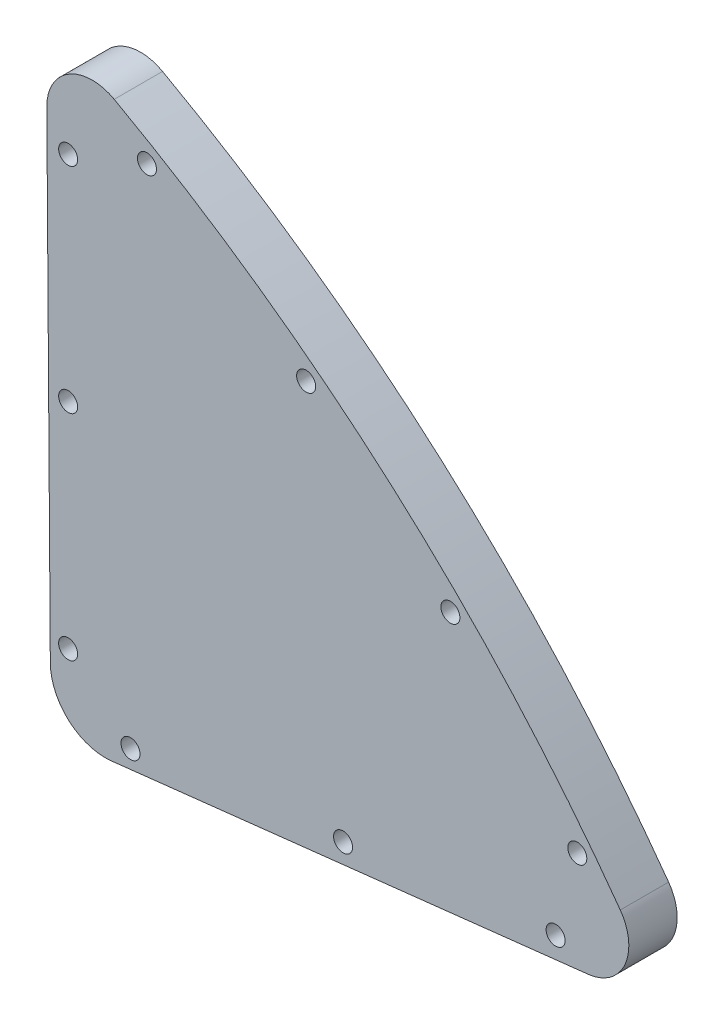
ISO-10303-21;
HEADER;
FILE_DESCRIPTION(('STEP AP214'),'2;1');
FILE_NAME('part.step','',(''),(''),'','','');
FILE_SCHEMA(('AUTOMOTIVE_DESIGN { 1 0 10303 214 1 1 1 1 }'));
ENDSEC;
DATA;
#1=APPLICATION_CONTEXT('core data for automotive mechanical design processes');
#2=APPLICATION_PROTOCOL_DEFINITION('international standard','automotive_design',2000,#1);
#3=PRODUCT_CONTEXT('',#1,'mechanical');
#4=PRODUCT('Part','Part','',(#3));
#5=PRODUCT_RELATED_PRODUCT_CATEGORY('part','',(#4));
#6=PRODUCT_DEFINITION_FORMATION('','',#4);
#7=PRODUCT_DEFINITION_CONTEXT('part definition',#1,'design');
#8=PRODUCT_DEFINITION('design','',#6,#7);
#9=PRODUCT_DEFINITION_SHAPE('','',#8);
#10=(LENGTH_UNIT() NAMED_UNIT(*) SI_UNIT(.MILLI.,.METRE.));
#11=(NAMED_UNIT(*) PLANE_ANGLE_UNIT() SI_UNIT($,.RADIAN.));
#12=(NAMED_UNIT(*) SI_UNIT($,.STERADIAN.) SOLID_ANGLE_UNIT());
#13=UNCERTAINTY_MEASURE_WITH_UNIT(LENGTH_MEASURE(1.E-05),#10,'distance_accuracy_value','');
#14=(GEOMETRIC_REPRESENTATION_CONTEXT(3) GLOBAL_UNCERTAINTY_ASSIGNED_CONTEXT((#13)) GLOBAL_UNIT_ASSIGNED_CONTEXT((#10,
#11,#12)) REPRESENTATION_CONTEXT('',''));
#15=CARTESIAN_POINT('',(0.,0.,0.));
#16=DIRECTION('',(0.,0.,1.));
#17=DIRECTION('',(1.,0.,0.));
#18=AXIS2_PLACEMENT_3D('',#15,#16,#17);
#19=CARTESIAN_POINT('',(-0.689341412487082,-11.2162631841353,12.7));
#20=DIRECTION('',(0.,0.,-1.));
#21=DIRECTION('',(-1.,0.,0.));
#22=AXIS2_PLACEMENT_3D('',#19,#20,#21);
#23=CYLINDRICAL_SURFACE('',#22,14.478);
#24=CARTESIAN_POINT('',(-0.689341412487082,-11.2162631841353,0.));
#25=DIRECTION('',(0.,0.,1.));
#26=DIRECTION('',(1.,0.,0.));
#27=AXIS2_PLACEMENT_3D('',#24,#25,#26);
#28=CIRCLE('',#27,14.478);
#29=CARTESIAN_POINT('',(-15.1669572143181,-11.3217368518089,0.));
#30=VERTEX_POINT('',#29);
#31=CARTESIAN_POINT('',(0.928877390943903,-25.6035440913888,0.));
#32=VERTEX_POINT('',#31);
#33=EDGE_CURVE('E123',#30,#32,#28,.T.);
#34=ORIENTED_EDGE('',*,*,#33,.T.);
#35=DIRECTION('',(0.,0.,-1.));
#36=VECTOR('',#35,1.);
#37=CARTESIAN_POINT('',(0.928877390943903,-25.6035440913888,12.7));
#38=LINE('',#37,#36);
#39=CARTESIAN_POINT('',(0.928877390943903,-25.6035440913888,12.7));
#40=VERTEX_POINT('',#39);
#41=EDGE_CURVE('E11',#40,#32,#38,.T.);
#42=ORIENTED_EDGE('',*,*,#41,.F.);
#43=CARTESIAN_POINT('',(-0.689341412487082,-11.2162631841353,12.7));
#44=DIRECTION('',(0.,0.,1.));
#45=DIRECTION('',(1.,0.,0.));
#46=AXIS2_PLACEMENT_3D('',#43,#44,#45);
#47=CIRCLE('',#46,14.478);
#48=CARTESIAN_POINT('',(-15.1669572143181,-11.3217368518089,12.7));
#49=VERTEX_POINT('',#48);
#50=EDGE_CURVE('E134',#49,#40,#47,.T.);
#51=ORIENTED_EDGE('',*,*,#50,.F.);
#52=DIRECTION('',(0.,0.,-1.));
#53=VECTOR('',#52,1.);
#54=CARTESIAN_POINT('',(-15.1669572143181,-11.3217368518089,12.7));
#55=LINE('',#54,#53);
#56=EDGE_CURVE('E119',#49,#30,#55,.T.);
#57=ORIENTED_EDGE('',*,*,#56,.T.);
#58=EDGE_LOOP('',(#34,#42,#51,#57));
#59=FACE_BOUND('',#58,.T.);
#60=ADVANCED_FACE('F39',(#59),#23,.T.);
#61=CARTESIAN_POINT('',(0.928877390943903,-25.6035440913888,12.7));
#62=DIRECTION('',(-0.111770880192778,0.993734003816379,0.));
#63=DIRECTION('',(-0.993734003816379,-0.111770880192778,0.));
#64=AXIS2_PLACEMENT_3D('',#61,#62,#63);
#65=PLANE('',#64);
#66=DIRECTION('',(0.993734003816379,0.111770880192778,0.));
#67=VECTOR('',#66,1.);
#68=CARTESIAN_POINT('',(0.928877390943903,-25.6035440913888,0.));
#69=LINE('',#68,#67);
#70=CARTESIAN_POINT('',(126.263071951833,-11.5064988151641,0.));
#71=VERTEX_POINT('',#70);
#72=EDGE_CURVE('E126',#32,#71,#69,.T.);
#73=ORIENTED_EDGE('',*,*,#72,.T.);
#74=DIRECTION('',(0.,0.,-1.));
#75=VECTOR('',#74,1.);
#76=CARTESIAN_POINT('',(126.263071951833,-11.5064988151641,12.7));
#77=LINE('',#76,#75);
#78=CARTESIAN_POINT('',(126.263071951833,-11.5064988151641,12.7));
#79=VERTEX_POINT('',#78);
#80=EDGE_CURVE('E47',#79,#71,#77,.T.);
#81=ORIENTED_EDGE('',*,*,#80,.F.);
#82=DIRECTION('',(0.993734003816379,0.111770880192778,0.));
#83=VECTOR('',#82,1.);
#84=CARTESIAN_POINT('',(0.928877390943903,-25.6035440913888,12.7));
#85=LINE('',#84,#83);
#86=EDGE_CURVE('E92',#40,#79,#85,.T.);
#87=ORIENTED_EDGE('',*,*,#86,.F.);
#88=ORIENTED_EDGE('',*,*,#41,.T.);
#89=EDGE_LOOP('',(#73,#81,#87,#88));
#90=FACE_BOUND('',#89,.T.);
#91=ADVANCED_FACE('F159',(#90),#65,.F.);
#92=CARTESIAN_POINT('',(124.928751184092,0.356697722395855,12.7));
#93=DIRECTION('',(0.,0.,-1.));
#94=DIRECTION('',(-1.,0.,0.));
#95=AXIS2_PLACEMENT_3D('',#92,#93,#94);
#96=CYLINDRICAL_SURFACE('',#95,11.938);
#97=CARTESIAN_POINT('',(124.928751184092,0.356697722395855,0.));
#98=DIRECTION('',(0.,0.,1.));
#99=DIRECTION('',(1.,0.,0.));
#100=AXIS2_PLACEMENT_3D('',#97,#98,#99);
#101=CIRCLE('',#100,11.938);
#102=CARTESIAN_POINT('',(134.616347536717,7.33282278639824,0.));
#103=VERTEX_POINT('',#102);
#104=EDGE_CURVE('E129',#71,#103,#101,.T.);
#105=ORIENTED_EDGE('',*,*,#104,.T.);
#106=DIRECTION('',(0.,0.,-1.));
#107=VECTOR('',#106,1.);
#108=CARTESIAN_POINT('',(134.616347536717,7.33282278639824,12.7));
#109=LINE('',#108,#107);
#110=CARTESIAN_POINT('',(134.616347536717,7.33282278639824,12.7));
#111=VERTEX_POINT('',#110);
#112=EDGE_CURVE('E114',#111,#103,#109,.T.);
#113=ORIENTED_EDGE('',*,*,#112,.F.);
#114=CARTESIAN_POINT('',(124.928751184092,0.356697722395855,12.7));
#115=DIRECTION('',(0.,0.,1.));
#116=DIRECTION('',(1.,0.,0.));
#117=AXIS2_PLACEMENT_3D('',#114,#115,#116);
#118=CIRCLE('',#117,11.938);
#119=EDGE_CURVE('E105',#79,#111,#118,.T.);
#120=ORIENTED_EDGE('',*,*,#119,.F.);
#121=ORIENTED_EDGE('',*,*,#80,.T.);
#122=EDGE_LOOP('',(#105,#113,#120,#121));
#123=FACE_BOUND('',#122,.T.);
#124=ADVANCED_FACE('F140',(#123),#96,.T.);
#125=CARTESIAN_POINT('',(-194.555809381209,-229.707001196831,12.7));
#126=DIRECTION('',(0.,0.,-1.));
#127=DIRECTION('',(-1.,0.,0.));
#128=AXIS2_PLACEMENT_3D('',#125,#126,#127);
#129=CYLINDRICAL_SURFACE('',#128,405.638);
#130=CARTESIAN_POINT('',(-194.555809381209,-229.707001196831,0.));
#131=DIRECTION('',(0.,0.,1.));
#132=DIRECTION('',(1.,0.,0.));
#133=AXIS2_PLACEMENT_3D('',#130,#131,#132);
#134=CIRCLE('',#133,405.638);
#135=CARTESIAN_POINT('',(1.62554957457208,125.335336338093,0.));
#136=VERTEX_POINT('',#135);
#137=EDGE_CURVE('E113',#103,#136,#134,.T.);
#138=ORIENTED_EDGE('',*,*,#137,.T.);
#139=DIRECTION('',(0.,0.,-1.));
#140=VECTOR('',#139,1.);
#141=CARTESIAN_POINT('',(1.62554957457208,125.335336338093,12.7));
#142=LINE('',#141,#140);
#143=CARTESIAN_POINT('',(1.62554957457208,125.335336338093,12.7));
#144=VERTEX_POINT('',#143);
#145=EDGE_CURVE('E110',#144,#136,#142,.T.);
#146=ORIENTED_EDGE('',*,*,#145,.F.);
#147=CARTESIAN_POINT('',(-194.555809381209,-229.707001196831,12.7));
#148=DIRECTION('',(0.,0.,1.));
#149=DIRECTION('',(1.,0.,0.));
#150=AXIS2_PLACEMENT_3D('',#147,#148,#149);
#151=CIRCLE('',#150,405.638);
#152=EDGE_CURVE('E99',#111,#144,#151,.T.);
#153=ORIENTED_EDGE('',*,*,#152,.F.);
#154=ORIENTED_EDGE('',*,*,#112,.T.);
#155=EDGE_LOOP('',(#138,#146,#153,#154));
#156=FACE_BOUND('',#155,.T.);
#157=ADVANCED_FACE('F111',(#156),#129,.T.);
#158=CARTESIAN_POINT('',(-4.14810344416408,114.886375872131,12.7));
#159=DIRECTION('',(0.,0.,-1.));
#160=DIRECTION('',(-1.,0.,0.));
#161=AXIS2_PLACEMENT_3D('',#158,#159,#160);
#162=CYLINDRICAL_SURFACE('',#161,11.938);
#163=CARTESIAN_POINT('',(-4.14810344416408,114.886375872131,0.));
#164=DIRECTION('',(0.,0.,1.));
#165=DIRECTION('',(1.,0.,0.));
#166=AXIS2_PLACEMENT_3D('',#163,#164,#165);
#167=CIRCLE('',#166,11.938);
#168=CARTESIAN_POINT('',(-16.0857866491827,114.799406356681,0.));
#169=VERTEX_POINT('',#168);
#170=EDGE_CURVE('E78',#136,#169,#167,.T.);
#171=ORIENTED_EDGE('',*,*,#170,.T.);
#172=DIRECTION('',(0.,0.,-1.));
#173=VECTOR('',#172,1.);
#174=CARTESIAN_POINT('',(-16.0857866491827,114.799406356681,12.7));
#175=LINE('',#174,#173);
#176=CARTESIAN_POINT('',(-16.0857866491827,114.799406356681,12.7));
#177=VERTEX_POINT('',#176);
#178=EDGE_CURVE('E115',#177,#169,#175,.T.);
#179=ORIENTED_EDGE('',*,*,#178,.F.);
#180=CARTESIAN_POINT('',(-4.14810344416408,114.886375872131,12.7));
#181=DIRECTION('',(0.,0.,1.));
#182=DIRECTION('',(1.,0.,0.));
#183=AXIS2_PLACEMENT_3D('',#180,#181,#182);
#184=CIRCLE('',#183,11.938);
#185=EDGE_CURVE('E103',#144,#177,#184,.T.);
#186=ORIENTED_EDGE('',*,*,#185,.F.);
#187=ORIENTED_EDGE('',*,*,#145,.T.);
#188=EDGE_LOOP('',(#171,#179,#186,#187));
#189=FACE_BOUND('',#188,.T.);
#190=ADVANCED_FACE('F117',(#189),#162,.T.);
#191=CARTESIAN_POINT('',(-16.0857866491827,114.799406356681,12.7));
#192=DIRECTION('',(0.999973463311992,0.00728509930056425,0.));
#193=DIRECTION('',(-0.00728509930056426,0.999973463311993,0.));
#194=AXIS2_PLACEMENT_3D('',#191,#192,#193);
#195=PLANE('',#194);
#196=DIRECTION('',(0.00728509930056426,-0.999973463311993,0.));
#197=VECTOR('',#196,1.);
#198=CARTESIAN_POINT('',(-16.0857866491827,114.799406356681,0.));
#199=LINE('',#198,#197);
#200=EDGE_CURVE('E84',#169,#30,#199,.T.);
#201=ORIENTED_EDGE('',*,*,#200,.T.);
#202=ORIENTED_EDGE('',*,*,#56,.F.);
#203=DIRECTION('',(0.00728509930056426,-0.999973463311993,0.));
#204=VECTOR('',#203,1.);
#205=CARTESIAN_POINT('',(-16.0857866491827,114.799406356681,12.7));
#206=LINE('',#205,#204);
#207=EDGE_CURVE('E55',#177,#49,#206,.T.);
#208=ORIENTED_EDGE('',*,*,#207,.F.);
#209=ORIENTED_EDGE('',*,*,#178,.T.);
#210=EDGE_LOOP('',(#201,#202,#208,#209));
#211=FACE_BOUND('',#210,.T.);
#212=ADVANCED_FACE('F147',(#211),#195,.F.);
#213=CARTESIAN_POINT('',(-0.689341412487082,-11.2162631841353,12.7));
#214=DIRECTION('',(0.,0.,1.));
#215=DIRECTION('',(1.,0.,0.));
#216=AXIS2_PLACEMENT_3D('',#213,#214,#215);
#217=PLANE('',#216);
#218=CARTESIAN_POINT('',(5.90257666632167,-20.287563201257,12.7));
#219=DIRECTION('',(0.,0.,-1.));
#220=DIRECTION('',(1.,0.,0.));
#221=AXIS2_PLACEMENT_3D('',#218,#219,#220);
#222=CIRCLE('',#221,2.5);
#223=CARTESIAN_POINT('',(8.40257666632167,-20.287563201257,12.7));
#224=VERTEX_POINT('',#223);
#225=EDGE_CURVE('E303',#224,#224,#222,.T.);
#226=ORIENTED_EDGE('',*,*,#225,.T.);
#227=EDGE_LOOP('',(#226));
#228=FACE_BOUND('',#227,.T.);
#229=CARTESIAN_POINT('',(61.7637506372474,-13.5920898356194,12.7));
#230=DIRECTION('',(0.,0.,-1.));
#231=DIRECTION('',(1.,0.,0.));
#232=AXIS2_PLACEMENT_3D('',#229,#230,#231);
#233=CIRCLE('',#232,2.50000000000002);
#234=CARTESIAN_POINT('',(64.2637506372475,-13.5920898356194,12.7));
#235=VERTEX_POINT('',#234);
#236=EDGE_CURVE('E307',#235,#235,#233,.T.);
#237=ORIENTED_EDGE('',*,*,#236,.T.);
#238=EDGE_LOOP('',(#237));
#239=FACE_BOUND('',#238,.T.);
#240=CARTESIAN_POINT('',(117.624924608173,-6.89661646998181,12.7));
#241=DIRECTION('',(0.,0.,-1.));
#242=DIRECTION('',(1.,0.,0.));
#243=AXIS2_PLACEMENT_3D('',#240,#241,#242);
#244=CIRCLE('',#243,2.49999999999999);
#245=CARTESIAN_POINT('',(120.124924608173,-6.89661646998181,12.7));
#246=VERTEX_POINT('',#245);
#247=EDGE_CURVE('E365',#246,#246,#244,.T.);
#248=ORIENTED_EDGE('',*,*,#247,.T.);
#249=EDGE_LOOP('',(#248));
#250=FACE_BOUND('',#249,.T.);
#251=CARTESIAN_POINT('',(123.320094620132,14.6431397409828,12.7));
#252=DIRECTION('',(0.,0.,-1.));
#253=DIRECTION('',(1.,0.,0.));
#254=AXIS2_PLACEMENT_3D('',#251,#252,#253);
#255=CIRCLE('',#254,2.49999999999999);
#256=CARTESIAN_POINT('',(125.820094620132,14.6431397409828,12.7));
#257=VERTEX_POINT('',#256);
#258=EDGE_CURVE('E359',#257,#257,#255,.T.);
#259=ORIENTED_EDGE('',*,*,#258,.T.);
#260=EDGE_LOOP('',(#259));
#261=FACE_BOUND('',#260,.T.);
#262=CARTESIAN_POINT('',(89.9647746684345,52.7821472196165,12.7));
#263=DIRECTION('',(0.,0.,-1.));
#264=DIRECTION('',(1.,0.,0.));
#265=AXIS2_PLACEMENT_3D('',#262,#263,#264);
#266=CIRCLE('',#265,2.50000000000001);
#267=CARTESIAN_POINT('',(92.4647746684345,52.7821472196165,12.7));
#268=VERTEX_POINT('',#267);
#269=EDGE_CURVE('E353',#268,#268,#266,.T.);
#270=ORIENTED_EDGE('',*,*,#269,.T.);
#271=EDGE_LOOP('',(#270));
#272=FACE_BOUND('',#271,.T.);
#273=CARTESIAN_POINT('',(10.2282521166026,114.989343253557,12.7));
#274=DIRECTION('',(0.,0.,-1.));
#275=DIRECTION('',(-1.,0.,0.));
#276=AXIS2_PLACEMENT_3D('',#273,#274,#275);
#277=CIRCLE('',#276,2.5);
#278=CARTESIAN_POINT('',(7.72825211660265,114.989343253557,12.7));
#279=VERTEX_POINT('',#278);
#280=EDGE_CURVE('E347',#279,#279,#277,.T.);
#281=ORIENTED_EDGE('',*,*,#280,.T.);
#282=EDGE_LOOP('',(#281));
#283=FACE_BOUND('',#282,.T.);
#284=CARTESIAN_POINT('',(52.0657485738519,86.4098899570876,12.7));
#285=DIRECTION('',(0.,0.,-1.));
#286=DIRECTION('',(-1.,0.,0.));
#287=AXIS2_PLACEMENT_3D('',#284,#285,#286);
#288=CIRCLE('',#287,2.5);
#289=CARTESIAN_POINT('',(49.5657485738519,86.4098899570876,12.7));
#290=VERTEX_POINT('',#289);
#291=EDGE_CURVE('E341',#290,#290,#288,.T.);
#292=ORIENTED_EDGE('',*,*,#291,.T.);
#293=EDGE_LOOP('',(#292));
#294=FACE_BOUND('',#293,.T.);
#295=CARTESIAN_POINT('',(-10.4806618711362,-5.75074293127617,12.7));
#296=DIRECTION('',(0.,0.,-1.));
#297=DIRECTION('',(-1.,0.,0.));
#298=AXIS2_PLACEMENT_3D('',#295,#296,#297);
#299=CIRCLE('',#298,2.5);
#300=CARTESIAN_POINT('',(-12.9806618711362,-5.75074293127617,12.7));
#301=VERTEX_POINT('',#300);
#302=EDGE_CURVE('E335',#301,#301,#299,.T.);
#303=ORIENTED_EDGE('',*,*,#302,.T.);
#304=EDGE_LOOP('',(#303));
#305=FACE_BOUND('',#304,.T.);
#306=CARTESIAN_POINT('',(-10.4806618711362,50.5102570687238,12.7));
#307=DIRECTION('',(0.,0.,-1.));
#308=DIRECTION('',(-1.,0.,0.));
#309=AXIS2_PLACEMENT_3D('',#306,#307,#308);
#310=CIRCLE('',#309,2.5);
#311=CARTESIAN_POINT('',(-12.9806618711362,50.5102570687238,12.7));
#312=VERTEX_POINT('',#311);
#313=EDGE_CURVE('E325',#312,#312,#310,.T.);
#314=ORIENTED_EDGE('',*,*,#313,.T.);
#315=EDGE_LOOP('',(#314));
#316=FACE_BOUND('',#315,.T.);
#317=CARTESIAN_POINT('',(-10.4806618711362,106.771257068724,12.7));
#318=DIRECTION('',(0.,0.,-1.));
#319=DIRECTION('',(-1.,0.,0.));
#320=AXIS2_PLACEMENT_3D('',#317,#318,#319);
#321=CIRCLE('',#320,2.5);
#322=CARTESIAN_POINT('',(-12.9806618711362,106.771257068724,12.7));
#323=VERTEX_POINT('',#322);
#324=EDGE_CURVE('E127',#323,#323,#321,.T.);
#325=ORIENTED_EDGE('',*,*,#324,.T.);
#326=EDGE_LOOP('',(#325));
#327=FACE_BOUND('',#326,.T.);
#328=ORIENTED_EDGE('',*,*,#50,.T.);
#329=ORIENTED_EDGE('',*,*,#86,.T.);
#330=ORIENTED_EDGE('',*,*,#119,.T.);
#331=ORIENTED_EDGE('',*,*,#152,.T.);
#332=ORIENTED_EDGE('',*,*,#185,.T.);
#333=ORIENTED_EDGE('',*,*,#207,.T.);
#334=EDGE_LOOP('',(#328,#329,#330,#331,#332,#333));
#335=FACE_BOUND('',#334,.T.);
#336=ADVANCED_FACE('F101',(#228,#239,#250,#261,#272,#283,#294,#305,#316,#327,#335),#217,.T.);
#337=CARTESIAN_POINT('',(-0.689341412487082,-11.2162631841353,0.));
#338=DIRECTION('',(0.,0.,1.));
#339=DIRECTION('',(1.,0.,0.));
#340=AXIS2_PLACEMENT_3D('',#337,#338,#339);
#341=PLANE('',#340);
#342=CARTESIAN_POINT('',(5.90257666632167,-20.287563201257,0.));
#343=DIRECTION('',(0.,0.,-1.));
#344=DIRECTION('',(1.,0.,0.));
#345=AXIS2_PLACEMENT_3D('',#342,#343,#344);
#346=CIRCLE('',#345,2.5);
#347=CARTESIAN_POINT('',(8.40257666632167,-20.287563201257,0.));
#348=VERTEX_POINT('',#347);
#349=EDGE_CURVE('E306',#348,#348,#346,.T.);
#350=ORIENTED_EDGE('',*,*,#349,.F.);
#351=EDGE_LOOP('',(#350));
#352=FACE_BOUND('',#351,.T.);
#353=CARTESIAN_POINT('',(61.7637506372474,-13.5920898356194,0.));
#354=DIRECTION('',(0.,0.,-1.));
#355=DIRECTION('',(1.,0.,0.));
#356=AXIS2_PLACEMENT_3D('',#353,#354,#355);
#357=CIRCLE('',#356,2.50000000000002);
#358=CARTESIAN_POINT('',(64.2637506372475,-13.5920898356194,0.));
#359=VERTEX_POINT('',#358);
#360=EDGE_CURVE('E310',#359,#359,#357,.T.);
#361=ORIENTED_EDGE('',*,*,#360,.F.);
#362=EDGE_LOOP('',(#361));
#363=FACE_BOUND('',#362,.T.);
#364=CARTESIAN_POINT('',(117.624924608173,-6.89661646998181,0.));
#365=DIRECTION('',(0.,0.,-1.));
#366=DIRECTION('',(1.,0.,0.));
#367=AXIS2_PLACEMENT_3D('',#364,#365,#366);
#368=CIRCLE('',#367,2.49999999999999);
#369=CARTESIAN_POINT('',(120.124924608173,-6.89661646998181,0.));
#370=VERTEX_POINT('',#369);
#371=EDGE_CURVE('E362',#370,#370,#368,.T.);
#372=ORIENTED_EDGE('',*,*,#371,.F.);
#373=EDGE_LOOP('',(#372));
#374=FACE_BOUND('',#373,.T.);
#375=CARTESIAN_POINT('',(123.320094620132,14.6431397409828,0.));
#376=DIRECTION('',(0.,0.,-1.));
#377=DIRECTION('',(1.,0.,0.));
#378=AXIS2_PLACEMENT_3D('',#375,#376,#377);
#379=CIRCLE('',#378,2.49999999999999);
#380=CARTESIAN_POINT('',(125.820094620132,14.6431397409828,0.));
#381=VERTEX_POINT('',#380);
#382=EDGE_CURVE('E356',#381,#381,#379,.T.);
#383=ORIENTED_EDGE('',*,*,#382,.F.);
#384=EDGE_LOOP('',(#383));
#385=FACE_BOUND('',#384,.T.);
#386=CARTESIAN_POINT('',(89.9647746684345,52.7821472196165,0.));
#387=DIRECTION('',(0.,0.,-1.));
#388=DIRECTION('',(1.,0.,0.));
#389=AXIS2_PLACEMENT_3D('',#386,#387,#388);
#390=CIRCLE('',#389,2.50000000000001);
#391=CARTESIAN_POINT('',(92.4647746684345,52.7821472196165,0.));
#392=VERTEX_POINT('',#391);
#393=EDGE_CURVE('E350',#392,#392,#390,.T.);
#394=ORIENTED_EDGE('',*,*,#393,.F.);
#395=EDGE_LOOP('',(#394));
#396=FACE_BOUND('',#395,.T.);
#397=CARTESIAN_POINT('',(10.2282521166026,114.989343253557,0.));
#398=DIRECTION('',(0.,0.,-1.));
#399=DIRECTION('',(-1.,0.,0.));
#400=AXIS2_PLACEMENT_3D('',#397,#398,#399);
#401=CIRCLE('',#400,2.5);
#402=CARTESIAN_POINT('',(7.72825211660265,114.989343253557,0.));
#403=VERTEX_POINT('',#402);
#404=EDGE_CURVE('E344',#403,#403,#401,.T.);
#405=ORIENTED_EDGE('',*,*,#404,.F.);
#406=EDGE_LOOP('',(#405));
#407=FACE_BOUND('',#406,.T.);
#408=CARTESIAN_POINT('',(52.0657485738519,86.4098899570876,0.));
#409=DIRECTION('',(0.,0.,-1.));
#410=DIRECTION('',(-1.,0.,0.));
#411=AXIS2_PLACEMENT_3D('',#408,#409,#410);
#412=CIRCLE('',#411,2.5);
#413=CARTESIAN_POINT('',(49.5657485738519,86.4098899570876,0.));
#414=VERTEX_POINT('',#413);
#415=EDGE_CURVE('E338',#414,#414,#412,.T.);
#416=ORIENTED_EDGE('',*,*,#415,.F.);
#417=EDGE_LOOP('',(#416));
#418=FACE_BOUND('',#417,.T.);
#419=CARTESIAN_POINT('',(-10.4806618711362,-5.75074293127617,0.));
#420=DIRECTION('',(0.,0.,-1.));
#421=DIRECTION('',(-1.,0.,0.));
#422=AXIS2_PLACEMENT_3D('',#419,#420,#421);
#423=CIRCLE('',#422,2.5);
#424=CARTESIAN_POINT('',(-12.9806618711362,-5.75074293127617,0.));
#425=VERTEX_POINT('',#424);
#426=EDGE_CURVE('E330',#425,#425,#423,.T.);
#427=ORIENTED_EDGE('',*,*,#426,.F.);
#428=EDGE_LOOP('',(#427));
#429=FACE_BOUND('',#428,.T.);
#430=CARTESIAN_POINT('',(-10.4806618711362,50.5102570687238,0.));
#431=DIRECTION('',(0.,0.,-1.));
#432=DIRECTION('',(-1.,0.,0.));
#433=AXIS2_PLACEMENT_3D('',#430,#431,#432);
#434=CIRCLE('',#433,2.5);
#435=CARTESIAN_POINT('',(-12.9806618711362,50.5102570687238,0.));
#436=VERTEX_POINT('',#435);
#437=EDGE_CURVE('E320',#436,#436,#434,.T.);
#438=ORIENTED_EDGE('',*,*,#437,.F.);
#439=EDGE_LOOP('',(#438));
#440=FACE_BOUND('',#439,.T.);
#441=CARTESIAN_POINT('',(-10.4806618711362,106.771257068724,0.));
#442=DIRECTION('',(0.,0.,-1.));
#443=DIRECTION('',(-1.,0.,0.));
#444=AXIS2_PLACEMENT_3D('',#441,#442,#443);
#445=CIRCLE('',#444,2.5);
#446=CARTESIAN_POINT('',(-12.9806618711362,106.771257068724,0.));
#447=VERTEX_POINT('',#446);
#448=EDGE_CURVE('E317',#447,#447,#445,.T.);
#449=ORIENTED_EDGE('',*,*,#448,.F.);
#450=EDGE_LOOP('',(#449));
#451=FACE_BOUND('',#450,.T.);
#452=ORIENTED_EDGE('',*,*,#33,.F.);
#453=ORIENTED_EDGE('',*,*,#200,.F.);
#454=ORIENTED_EDGE('',*,*,#170,.F.);
#455=ORIENTED_EDGE('',*,*,#137,.F.);
#456=ORIENTED_EDGE('',*,*,#104,.F.);
#457=ORIENTED_EDGE('',*,*,#72,.F.);
#458=EDGE_LOOP('',(#452,#453,#454,#455,#456,#457));
#459=FACE_BOUND('',#458,.T.);
#460=ADVANCED_FACE('F143',(#352,#363,#374,#385,#396,#407,#418,#429,#440,#451,#459),#341,.F.);
#461=CARTESIAN_POINT('',(-10.4806618711362,106.771257068724,12.7));
#462=DIRECTION('',(0.,0.,-1.));
#463=DIRECTION('',(-1.,0.,0.));
#464=AXIS2_PLACEMENT_3D('',#461,#462,#463);
#465=CYLINDRICAL_SURFACE('',#464,2.5);
#466=ORIENTED_EDGE('',*,*,#324,.F.);
#467=EDGE_LOOP('',(#466));
#468=FACE_BOUND('',#467,.T.);
#469=ORIENTED_EDGE('',*,*,#448,.T.);
#470=EDGE_LOOP('',(#469));
#471=FACE_BOUND('',#470,.T.);
#472=ADVANCED_FACE('F198',(#468,#471),#465,.F.);
#473=CARTESIAN_POINT('',(-10.4806618711362,50.5102570687238,12.7));
#474=DIRECTION('',(0.,0.,-1.));
#475=DIRECTION('',(-1.,0.,0.));
#476=AXIS2_PLACEMENT_3D('',#473,#474,#475);
#477=CYLINDRICAL_SURFACE('',#476,2.5);
#478=ORIENTED_EDGE('',*,*,#313,.F.);
#479=EDGE_LOOP('',(#478));
#480=FACE_BOUND('',#479,.T.);
#481=ORIENTED_EDGE('',*,*,#437,.T.);
#482=EDGE_LOOP('',(#481));
#483=FACE_BOUND('',#482,.T.);
#484=ADVANCED_FACE('F207',(#480,#483),#477,.F.);
#485=CARTESIAN_POINT('',(-10.4806618711362,-5.75074293127617,12.7));
#486=DIRECTION('',(0.,0.,-1.));
#487=DIRECTION('',(-1.,0.,0.));
#488=AXIS2_PLACEMENT_3D('',#485,#486,#487);
#489=CYLINDRICAL_SURFACE('',#488,2.5);
#490=ORIENTED_EDGE('',*,*,#302,.F.);
#491=EDGE_LOOP('',(#490));
#492=FACE_BOUND('',#491,.T.);
#493=ORIENTED_EDGE('',*,*,#426,.T.);
#494=EDGE_LOOP('',(#493));
#495=FACE_BOUND('',#494,.T.);
#496=ADVANCED_FACE('F217',(#492,#495),#489,.F.);
#497=CARTESIAN_POINT('',(52.0657485738519,86.4098899570876,12.7));
#498=DIRECTION('',(0.,0.,-1.));
#499=DIRECTION('',(-1.,0.,0.));
#500=AXIS2_PLACEMENT_3D('',#497,#498,#499);
#501=CYLINDRICAL_SURFACE('',#500,2.5);
#502=ORIENTED_EDGE('',*,*,#291,.F.);
#503=EDGE_LOOP('',(#502));
#504=FACE_BOUND('',#503,.T.);
#505=ORIENTED_EDGE('',*,*,#415,.T.);
#506=EDGE_LOOP('',(#505));
#507=FACE_BOUND('',#506,.T.);
#508=ADVANCED_FACE('F227',(#504,#507),#501,.F.);
#509=CARTESIAN_POINT('',(10.2282521166026,114.989343253557,12.7));
#510=DIRECTION('',(0.,0.,-1.));
#511=DIRECTION('',(-1.,0.,0.));
#512=AXIS2_PLACEMENT_3D('',#509,#510,#511);
#513=CYLINDRICAL_SURFACE('',#512,2.5);
#514=ORIENTED_EDGE('',*,*,#280,.F.);
#515=EDGE_LOOP('',(#514));
#516=FACE_BOUND('',#515,.T.);
#517=ORIENTED_EDGE('',*,*,#404,.T.);
#518=EDGE_LOOP('',(#517));
#519=FACE_BOUND('',#518,.T.);
#520=ADVANCED_FACE('F237',(#516,#519),#513,.F.);
#521=CARTESIAN_POINT('',(89.9647746684345,52.7821472196165,12.7));
#522=DIRECTION('',(0.,0.,-1.));
#523=DIRECTION('',(-1.,0.,0.));
#524=AXIS2_PLACEMENT_3D('',#521,#522,#523);
#525=CYLINDRICAL_SURFACE('',#524,2.50000000000001);
#526=ORIENTED_EDGE('',*,*,#269,.F.);
#527=EDGE_LOOP('',(#526));
#528=FACE_BOUND('',#527,.T.);
#529=ORIENTED_EDGE('',*,*,#393,.T.);
#530=EDGE_LOOP('',(#529));
#531=FACE_BOUND('',#530,.T.);
#532=ADVANCED_FACE('F247',(#528,#531),#525,.F.);
#533=CARTESIAN_POINT('',(123.320094620132,14.6431397409828,12.7));
#534=DIRECTION('',(0.,0.,-1.));
#535=DIRECTION('',(-1.,0.,0.));
#536=AXIS2_PLACEMENT_3D('',#533,#534,#535);
#537=CYLINDRICAL_SURFACE('',#536,2.49999999999999);
#538=ORIENTED_EDGE('',*,*,#258,.F.);
#539=EDGE_LOOP('',(#538));
#540=FACE_BOUND('',#539,.T.);
#541=ORIENTED_EDGE('',*,*,#382,.T.);
#542=EDGE_LOOP('',(#541));
#543=FACE_BOUND('',#542,.T.);
#544=ADVANCED_FACE('F257',(#540,#543),#537,.F.);
#545=CARTESIAN_POINT('',(117.624924608173,-6.89661646998181,12.7));
#546=DIRECTION('',(0.,0.,-1.));
#547=DIRECTION('',(-1.,0.,0.));
#548=AXIS2_PLACEMENT_3D('',#545,#546,#547);
#549=CYLINDRICAL_SURFACE('',#548,2.49999999999999);
#550=ORIENTED_EDGE('',*,*,#247,.F.);
#551=EDGE_LOOP('',(#550));
#552=FACE_BOUND('',#551,.T.);
#553=ORIENTED_EDGE('',*,*,#371,.T.);
#554=EDGE_LOOP('',(#553));
#555=FACE_BOUND('',#554,.T.);
#556=ADVANCED_FACE('F267',(#552,#555),#549,.F.);
#557=CARTESIAN_POINT('',(61.7637506372474,-13.5920898356194,12.7));
#558=DIRECTION('',(0.,0.,-1.));
#559=DIRECTION('',(-1.,0.,0.));
#560=AXIS2_PLACEMENT_3D('',#557,#558,#559);
#561=CYLINDRICAL_SURFACE('',#560,2.50000000000002);
#562=ORIENTED_EDGE('',*,*,#236,.F.);
#563=EDGE_LOOP('',(#562));
#564=FACE_BOUND('',#563,.T.);
#565=ORIENTED_EDGE('',*,*,#360,.T.);
#566=EDGE_LOOP('',(#565));
#567=FACE_BOUND('',#566,.T.);
#568=ADVANCED_FACE('F277',(#564,#567),#561,.F.);
#569=CARTESIAN_POINT('',(5.90257666632167,-20.287563201257,12.7));
#570=DIRECTION('',(0.,0.,-1.));
#571=DIRECTION('',(-1.,0.,0.));
#572=AXIS2_PLACEMENT_3D('',#569,#570,#571);
#573=CYLINDRICAL_SURFACE('',#572,2.5);
#574=ORIENTED_EDGE('',*,*,#225,.F.);
#575=EDGE_LOOP('',(#574));
#576=FACE_BOUND('',#575,.T.);
#577=ORIENTED_EDGE('',*,*,#349,.T.);
#578=EDGE_LOOP('',(#577));
#579=FACE_BOUND('',#578,.T.);
#580=ADVANCED_FACE('F287',(#576,#579),#573,.F.);
#581=CLOSED_SHELL('',(#60,#91,#124,#157,#190,#212,#336,#460,#472,#484,#496,#508,#520,#532,#544,
#556,#568,#580));
#582=MANIFOLD_SOLID_BREP('B2',#581);
#583=ADVANCED_BREP_SHAPE_REPRESENTATION('',(#18,#582),#14);
#584=SHAPE_DEFINITION_REPRESENTATION(#9,#583);
ENDSEC;
END-ISO-10303-21;
